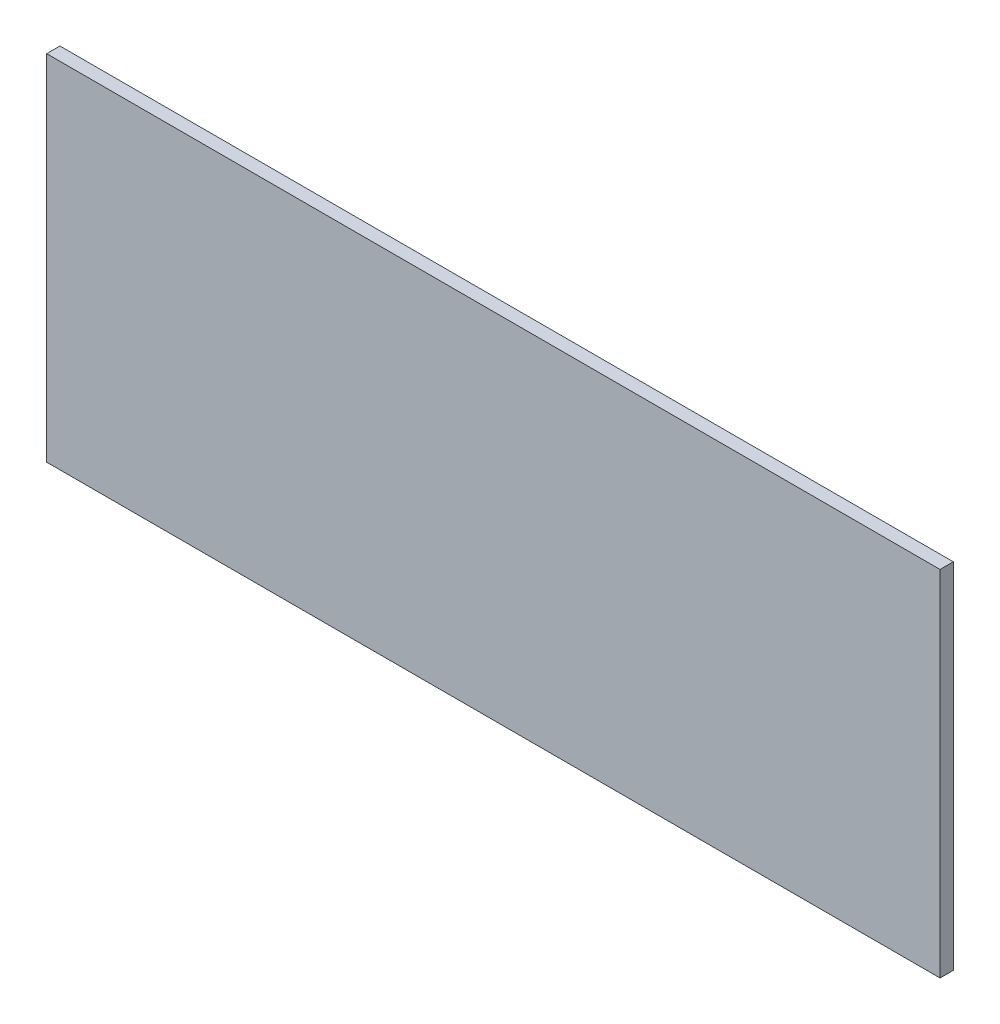
ISO-10303-21;
HEADER;
FILE_DESCRIPTION(('STEP AP214'),'2;1');
FILE_NAME('part.step','',(''),(''),'','','');
FILE_SCHEMA(('AUTOMOTIVE_DESIGN { 1 0 10303 214 1 1 1 1 }'));
ENDSEC;
DATA;
#1=APPLICATION_CONTEXT('core data for automotive mechanical design processes');
#2=APPLICATION_PROTOCOL_DEFINITION('international standard','automotive_design',2000,#1);
#3=PRODUCT_CONTEXT('',#1,'mechanical');
#4=PRODUCT('Part','Part','',(#3));
#5=PRODUCT_RELATED_PRODUCT_CATEGORY('part','',(#4));
#6=PRODUCT_DEFINITION_FORMATION('','',#4);
#7=PRODUCT_DEFINITION_CONTEXT('part definition',#1,'design');
#8=PRODUCT_DEFINITION('design','',#6,#7);
#9=PRODUCT_DEFINITION_SHAPE('','',#8);
#10=(LENGTH_UNIT() NAMED_UNIT(*) SI_UNIT(.MILLI.,.METRE.));
#11=(NAMED_UNIT(*) PLANE_ANGLE_UNIT() SI_UNIT($,.RADIAN.));
#12=(NAMED_UNIT(*) SI_UNIT($,.STERADIAN.) SOLID_ANGLE_UNIT());
#13=UNCERTAINTY_MEASURE_WITH_UNIT(LENGTH_MEASURE(1.E-05),#10,'distance_accuracy_value','');
#14=(GEOMETRIC_REPRESENTATION_CONTEXT(3) GLOBAL_UNCERTAINTY_ASSIGNED_CONTEXT((#13)) GLOBAL_UNIT_ASSIGNED_CONTEXT((#10,
#11,#12)) REPRESENTATION_CONTEXT('',''));
#15=CARTESIAN_POINT('',(0.,0.,0.));
#16=DIRECTION('',(0.,0.,1.));
#17=DIRECTION('',(1.,0.,0.));
#18=AXIS2_PLACEMENT_3D('',#15,#16,#17);
#19=CARTESIAN_POINT('',(-50.5,-20.,1.5));
#20=DIRECTION('',(1.,0.,0.));
#21=DIRECTION('',(0.,0.,-1.));
#22=AXIS2_PLACEMENT_3D('',#19,#20,#21);
#23=PLANE('',#22);
#24=DIRECTION('',(0.,-1.,0.));
#25=VECTOR('',#24,1.);
#26=CARTESIAN_POINT('',(-50.5,-20.,0.));
#27=LINE('',#26,#25);
#28=CARTESIAN_POINT('',(-50.5,20.,0.));
#29=VERTEX_POINT('',#28);
#30=CARTESIAN_POINT('',(-50.5,-20.,0.));
#31=VERTEX_POINT('',#30);
#32=EDGE_CURVE('E97',#29,#31,#27,.T.);
#33=ORIENTED_EDGE('',*,*,#32,.T.);
#34=DIRECTION('',(0.,0.,-1.));
#35=VECTOR('',#34,1.);
#36=CARTESIAN_POINT('',(-50.5,-20.,1.5));
#37=LINE('',#36,#35);
#38=CARTESIAN_POINT('',(-50.5,-20.,1.5));
#39=VERTEX_POINT('',#38);
#40=EDGE_CURVE('E11',#39,#31,#37,.T.);
#41=ORIENTED_EDGE('',*,*,#40,.F.);
#42=DIRECTION('',(0.,-1.,0.));
#43=VECTOR('',#42,1.);
#44=CARTESIAN_POINT('',(-50.5,-20.,1.5));
#45=LINE('',#44,#43);
#46=CARTESIAN_POINT('',(-50.5,20.,1.5));
#47=VERTEX_POINT('',#46);
#48=EDGE_CURVE('E85',#47,#39,#45,.T.);
#49=ORIENTED_EDGE('',*,*,#48,.F.);
#50=DIRECTION('',(0.,0.,-1.));
#51=VECTOR('',#50,1.);
#52=CARTESIAN_POINT('',(-50.5,20.,1.5));
#53=LINE('',#52,#51);
#54=EDGE_CURVE('E93',#47,#29,#53,.T.);
#55=ORIENTED_EDGE('',*,*,#54,.T.);
#56=EDGE_LOOP('',(#33,#41,#49,#55));
#57=FACE_BOUND('',#56,.T.);
#58=ADVANCED_FACE('F34',(#57),#23,.F.);
#59=CARTESIAN_POINT('',(-50.5,-20.,1.5));
#60=DIRECTION('',(0.,1.,0.));
#61=DIRECTION('',(0.,0.,1.));
#62=AXIS2_PLACEMENT_3D('',#59,#60,#61);
#63=PLANE('',#62);
#64=DIRECTION('',(1.,0.,0.));
#65=VECTOR('',#64,1.);
#66=CARTESIAN_POINT('',(-50.5,-20.,0.));
#67=LINE('',#66,#65);
#68=CARTESIAN_POINT('',(50.5,-20.,0.));
#69=VERTEX_POINT('',#68);
#70=EDGE_CURVE('E89',#31,#69,#67,.T.);
#71=ORIENTED_EDGE('',*,*,#70,.T.);
#72=DIRECTION('',(0.,0.,-1.));
#73=VECTOR('',#72,1.);
#74=CARTESIAN_POINT('',(50.5,-20.,1.5));
#75=LINE('',#74,#73);
#76=CARTESIAN_POINT('',(50.5,-20.,1.5));
#77=VERTEX_POINT('',#76);
#78=EDGE_CURVE('E42',#77,#69,#75,.T.);
#79=ORIENTED_EDGE('',*,*,#78,.F.);
#80=DIRECTION('',(1.,0.,0.));
#81=VECTOR('',#80,1.);
#82=CARTESIAN_POINT('',(-50.5,-20.,1.5));
#83=LINE('',#82,#81);
#84=EDGE_CURVE('E80',#39,#77,#83,.T.);
#85=ORIENTED_EDGE('',*,*,#84,.F.);
#86=ORIENTED_EDGE('',*,*,#40,.T.);
#87=EDGE_LOOP('',(#71,#79,#85,#86));
#88=FACE_BOUND('',#87,.T.);
#89=ADVANCED_FACE('F88',(#88),#63,.F.);
#90=CARTESIAN_POINT('',(50.5,-20.,1.5));
#91=DIRECTION('',(-1.,0.,0.));
#92=DIRECTION('',(0.,0.,1.));
#93=AXIS2_PLACEMENT_3D('',#90,#91,#92);
#94=PLANE('',#93);
#95=DIRECTION('',(0.,1.,0.));
#96=VECTOR('',#95,1.);
#97=CARTESIAN_POINT('',(50.5,-20.,0.));
#98=LINE('',#97,#96);
#99=CARTESIAN_POINT('',(50.5,20.,0.));
#100=VERTEX_POINT('',#99);
#101=EDGE_CURVE('E67',#69,#100,#98,.T.);
#102=ORIENTED_EDGE('',*,*,#101,.T.);
#103=DIRECTION('',(0.,0.,-1.));
#104=VECTOR('',#103,1.);
#105=CARTESIAN_POINT('',(50.5,20.,1.5));
#106=LINE('',#105,#104);
#107=CARTESIAN_POINT('',(50.5,20.,1.5));
#108=VERTEX_POINT('',#107);
#109=EDGE_CURVE('E90',#108,#100,#106,.T.);
#110=ORIENTED_EDGE('',*,*,#109,.F.);
#111=DIRECTION('',(0.,1.,0.));
#112=VECTOR('',#111,1.);
#113=CARTESIAN_POINT('',(50.5,-20.,1.5));
#114=LINE('',#113,#112);
#115=EDGE_CURVE('E83',#77,#108,#114,.T.);
#116=ORIENTED_EDGE('',*,*,#115,.F.);
#117=ORIENTED_EDGE('',*,*,#78,.T.);
#118=EDGE_LOOP('',(#102,#110,#116,#117));
#119=FACE_BOUND('',#118,.T.);
#120=ADVANCED_FACE('F91',(#119),#94,.F.);
#121=CARTESIAN_POINT('',(-50.5,20.,1.5));
#122=DIRECTION('',(0.,-1.,0.));
#123=DIRECTION('',(0.,0.,-1.));
#124=AXIS2_PLACEMENT_3D('',#121,#122,#123);
#125=PLANE('',#124);
#126=DIRECTION('',(-1.,0.,0.));
#127=VECTOR('',#126,1.);
#128=CARTESIAN_POINT('',(-50.5,20.,0.));
#129=LINE('',#128,#127);
#130=EDGE_CURVE('E73',#100,#29,#129,.T.);
#131=ORIENTED_EDGE('',*,*,#130,.T.);
#132=ORIENTED_EDGE('',*,*,#54,.F.);
#133=DIRECTION('',(-1.,0.,0.));
#134=VECTOR('',#133,1.);
#135=CARTESIAN_POINT('',(-50.5,20.,1.5));
#136=LINE('',#135,#134);
#137=EDGE_CURVE('E50',#108,#47,#136,.T.);
#138=ORIENTED_EDGE('',*,*,#137,.F.);
#139=ORIENTED_EDGE('',*,*,#109,.T.);
#140=EDGE_LOOP('',(#131,#132,#138,#139));
#141=FACE_BOUND('',#140,.T.);
#142=ADVANCED_FACE('F104',(#141),#125,.F.);
#143=CARTESIAN_POINT('',(-50.5,20.,1.5));
#144=DIRECTION('',(0.,0.,-1.));
#145=DIRECTION('',(-1.,0.,0.));
#146=AXIS2_PLACEMENT_3D('',#143,#144,#145);
#147=PLANE('',#146);
#148=ORIENTED_EDGE('',*,*,#48,.T.);
#149=ORIENTED_EDGE('',*,*,#84,.T.);
#150=ORIENTED_EDGE('',*,*,#115,.T.);
#151=ORIENTED_EDGE('',*,*,#137,.T.);
#152=EDGE_LOOP('',(#148,#149,#150,#151));
#153=FACE_BOUND('',#152,.T.);
#154=ADVANCED_FACE('F81',(#153),#147,.F.);
#155=CARTESIAN_POINT('',(-50.5,20.,0.));
#156=DIRECTION('',(0.,0.,-1.));
#157=DIRECTION('',(-1.,0.,0.));
#158=AXIS2_PLACEMENT_3D('',#155,#156,#157);
#159=PLANE('',#158);
#160=ORIENTED_EDGE('',*,*,#32,.F.);
#161=ORIENTED_EDGE('',*,*,#130,.F.);
#162=ORIENTED_EDGE('',*,*,#101,.F.);
#163=ORIENTED_EDGE('',*,*,#70,.F.);
#164=EDGE_LOOP('',(#160,#161,#162,#163));
#165=FACE_BOUND('',#164,.T.);
#166=ADVANCED_FACE('F107',(#165),#159,.T.);
#167=CLOSED_SHELL('',(#58,#89,#120,#142,#154,#166));
#168=MANIFOLD_SOLID_BREP('B2',#167);
#169=ADVANCED_BREP_SHAPE_REPRESENTATION('',(#18,#168),#14);
#170=SHAPE_DEFINITION_REPRESENTATION(#9,#169);
ENDSEC;
END-ISO-10303-21;
